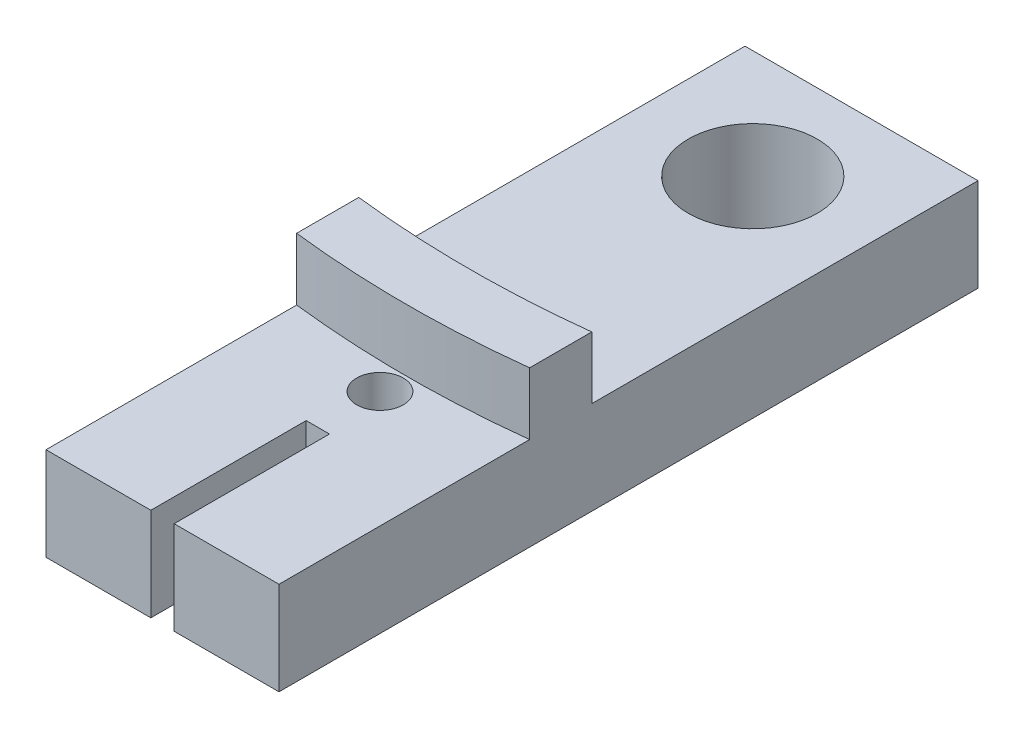
ISO-10303-21;
HEADER;
FILE_DESCRIPTION(('STEP AP214'),'2;1');
FILE_NAME('part.step','',(''),(''),'','','');
FILE_SCHEMA(('AUTOMOTIVE_DESIGN { 1 0 10303 214 1 1 1 1 }'));
ENDSEC;
DATA;
#1=APPLICATION_CONTEXT('core data for automotive mechanical design processes');
#2=APPLICATION_PROTOCOL_DEFINITION('international standard','automotive_design',2000,#1);
#3=PRODUCT_CONTEXT('',#1,'mechanical');
#4=PRODUCT('Part','Part','',(#3));
#5=PRODUCT_RELATED_PRODUCT_CATEGORY('part','',(#4));
#6=PRODUCT_DEFINITION_FORMATION('','',#4);
#7=PRODUCT_DEFINITION_CONTEXT('part definition',#1,'design');
#8=PRODUCT_DEFINITION('design','',#6,#7);
#9=PRODUCT_DEFINITION_SHAPE('','',#8);
#10=(LENGTH_UNIT() NAMED_UNIT(*) SI_UNIT(.MILLI.,.METRE.));
#11=(NAMED_UNIT(*) PLANE_ANGLE_UNIT() SI_UNIT($,.RADIAN.));
#12=(NAMED_UNIT(*) SI_UNIT($,.STERADIAN.) SOLID_ANGLE_UNIT());
#13=UNCERTAINTY_MEASURE_WITH_UNIT(LENGTH_MEASURE(1.E-05),#10,'distance_accuracy_value','');
#14=(GEOMETRIC_REPRESENTATION_CONTEXT(3) GLOBAL_UNCERTAINTY_ASSIGNED_CONTEXT((#13)) GLOBAL_UNIT_ASSIGNED_CONTEXT((#10,
#11,#12)) REPRESENTATION_CONTEXT('',''));
#15=CARTESIAN_POINT('',(0.,0.,0.));
#16=DIRECTION('',(0.,0.,1.));
#17=DIRECTION('',(1.,0.,0.));
#18=AXIS2_PLACEMENT_3D('',#15,#16,#17);
#19=CARTESIAN_POINT('',(7.50000000000001,6.,17.5));
#20=DIRECTION('',(0.,0.,-1.));
#21=DIRECTION('',(-1.,0.,0.));
#22=AXIS2_PLACEMENT_3D('',#19,#20,#21);
#23=PLANE('',#22);
#24=DIRECTION('',(0.,1.,0.));
#25=VECTOR('',#24,1.);
#26=CARTESIAN_POINT('',(-0.749999999999996,6.,17.5));
#27=LINE('',#26,#25);
#28=CARTESIAN_POINT('',(-0.749999999999995,0.,17.5));
#29=VERTEX_POINT('',#28);
#30=CARTESIAN_POINT('',(-0.749999999999995,6.,17.5));
#31=VERTEX_POINT('',#30);
#32=EDGE_CURVE('E54',#29,#31,#27,.T.);
#33=ORIENTED_EDGE('',*,*,#32,.F.);
#34=DIRECTION('',(1.,0.,0.));
#35=VECTOR('',#34,1.);
#36=CARTESIAN_POINT('',(7.50000000000001,0.,17.5));
#37=LINE('',#36,#35);
#38=CARTESIAN_POINT('',(0.750000000000004,0.,17.5));
#39=VERTEX_POINT('',#38);
#40=EDGE_CURVE('E132',#29,#39,#37,.T.);
#41=ORIENTED_EDGE('',*,*,#40,.T.);
#42=DIRECTION('',(0.,-1.,0.));
#43=VECTOR('',#42,1.);
#44=CARTESIAN_POINT('',(0.750000000000004,6.,17.5));
#45=LINE('',#44,#43);
#46=CARTESIAN_POINT('',(0.750000000000004,6.,17.5));
#47=VERTEX_POINT('',#46);
#48=EDGE_CURVE('E158',#47,#39,#45,.T.);
#49=ORIENTED_EDGE('',*,*,#48,.F.);
#50=DIRECTION('',(1.,0.,0.));
#51=VECTOR('',#50,1.);
#52=CARTESIAN_POINT('',(7.50000000000001,6.,17.5));
#53=LINE('',#52,#51);
#54=EDGE_CURVE('E50',#31,#47,#53,.T.);
#55=ORIENTED_EDGE('',*,*,#54,.F.);
#56=EDGE_LOOP('',(#33,#41,#49,#55));
#57=FACE_BOUND('',#56,.T.);
#58=ADVANCED_FACE('F35',(#57),#23,.F.);
#59=CARTESIAN_POINT('',(0.,6.,0.));
#60=DIRECTION('',(0.,1.,0.));
#61=DIRECTION('',(0.,0.,1.));
#62=AXIS2_PLACEMENT_3D('',#59,#60,#61);
#63=PLANE('',#62);
#64=CARTESIAN_POINT('',(0.,6.,-57.2));
#65=DIRECTION('',(0.,-1.,0.));
#66=DIRECTION('',(0.,0.,-1.));
#67=AXIS2_PLACEMENT_3D('',#64,#65,#66);
#68=CIRCLE('',#67,65.);
#69=CARTESIAN_POINT('',(7.50000000000001,6.,7.36585785072479));
#70=VERTEX_POINT('',#69);
#71=CARTESIAN_POINT('',(-7.5,6.,7.36585785072479));
#72=VERTEX_POINT('',#71);
#73=EDGE_CURVE('E177',#70,#72,#68,.T.);
#74=ORIENTED_EDGE('',*,*,#73,.F.);
#75=DIRECTION('',(0.,0.,-1.));
#76=VECTOR('',#75,1.);
#77=CARTESIAN_POINT('',(7.50000000000001,6.,17.5));
#78=LINE('',#77,#76);
#79=CARTESIAN_POINT('',(7.5,6.,-17.5));
#80=VERTEX_POINT('',#79);
#81=EDGE_CURVE('E219',#70,#80,#78,.T.);
#82=ORIENTED_EDGE('',*,*,#81,.T.);
#83=DIRECTION('',(-1.,0.,0.));
#84=VECTOR('',#83,1.);
#85=CARTESIAN_POINT('',(7.5,6.,-17.5));
#86=LINE('',#85,#84);
#87=CARTESIAN_POINT('',(-7.5,6.,-17.5));
#88=VERTEX_POINT('',#87);
#89=EDGE_CURVE('E222',#80,#88,#86,.T.);
#90=ORIENTED_EDGE('',*,*,#89,.T.);
#91=DIRECTION('',(0.,0.,1.));
#92=VECTOR('',#91,1.);
#93=CARTESIAN_POINT('',(-7.5,6.,17.5));
#94=LINE('',#93,#92);
#95=EDGE_CURVE('E215',#88,#72,#94,.T.);
#96=ORIENTED_EDGE('',*,*,#95,.T.);
#97=EDGE_LOOP('',(#74,#82,#90,#96));
#98=FACE_BOUND('',#97,.T.);
#99=CARTESIAN_POINT('',(0.,6.,-10.5));
#100=DIRECTION('',(0.,1.,0.));
#101=DIRECTION('',(0.,0.,1.));
#102=AXIS2_PLACEMENT_3D('',#99,#100,#101);
#103=CIRCLE('',#102,4.15);
#104=CARTESIAN_POINT('',(0.,6.,-6.35000000000002));
#105=VERTEX_POINT('',#104);
#106=EDGE_CURVE('E133',#105,#105,#103,.T.);
#107=ORIENTED_EDGE('',*,*,#106,.F.);
#108=EDGE_LOOP('',(#107));
#109=FACE_BOUND('',#108,.T.);
#110=ADVANCED_FACE('F247',(#98,#109),#63,.T.);
#111=CARTESIAN_POINT('',(0.,6.,-53.2));
#112=DIRECTION('',(0.,1.,0.));
#113=DIRECTION('',(0.,0.,1.));
#114=AXIS2_PLACEMENT_3D('',#111,#112,#113);
#115=CIRCLE('',#114,65.);
#116=CARTESIAN_POINT('',(-7.5,6.,11.3658578507248));
#117=VERTEX_POINT('',#116);
#118=CARTESIAN_POINT('',(7.50000000000001,6.,11.3658578507248));
#119=VERTEX_POINT('',#118);
#120=EDGE_CURVE('E182',#117,#119,#115,.T.);
#121=ORIENTED_EDGE('',*,*,#120,.F.);
#122=CARTESIAN_POINT('',(-7.5,6.,27.5));
#123=VERTEX_POINT('',#122);
#124=EDGE_CURVE('E217',#117,#123,#94,.T.);
#125=ORIENTED_EDGE('',*,*,#124,.T.);
#126=DIRECTION('',(-1.,0.,0.));
#127=VECTOR('',#126,1.);
#128=CARTESIAN_POINT('',(-0.749999999999996,6.,27.5));
#129=LINE('',#128,#127);
#130=CARTESIAN_POINT('',(-0.749999999999996,6.,27.5));
#131=VERTEX_POINT('',#130);
#132=EDGE_CURVE('E148',#131,#123,#129,.T.);
#133=ORIENTED_EDGE('',*,*,#132,.F.);
#134=DIRECTION('',(0.,0.,-1.));
#135=VECTOR('',#134,1.);
#136=CARTESIAN_POINT('',(-0.749999999999996,6.,27.5));
#137=LINE('',#136,#135);
#138=EDGE_CURVE('E153',#131,#31,#137,.T.);
#139=ORIENTED_EDGE('',*,*,#138,.T.);
#140=ORIENTED_EDGE('',*,*,#54,.T.);
#141=DIRECTION('',(0.,0.,-1.));
#142=VECTOR('',#141,1.);
#143=CARTESIAN_POINT('',(0.750000000000004,6.,27.5));
#144=LINE('',#143,#142);
#145=CARTESIAN_POINT('',(0.750000000000004,6.,27.5));
#146=VERTEX_POINT('',#145);
#147=EDGE_CURVE('E174',#146,#47,#144,.T.);
#148=ORIENTED_EDGE('',*,*,#147,.F.);
#149=DIRECTION('',(-1.,0.,0.));
#150=VECTOR('',#149,1.);
#151=CARTESIAN_POINT('',(0.750000000000004,6.,27.5));
#152=LINE('',#151,#150);
#153=CARTESIAN_POINT('',(7.50000000000001,6.,27.5));
#154=VERTEX_POINT('',#153);
#155=EDGE_CURVE('E162',#154,#146,#152,.T.);
#156=ORIENTED_EDGE('',*,*,#155,.F.);
#157=EDGE_CURVE('E220',#154,#119,#78,.T.);
#158=ORIENTED_EDGE('',*,*,#157,.T.);
#159=EDGE_LOOP('',(#121,#125,#133,#139,#140,#148,#156,#158));
#160=FACE_BOUND('',#159,.T.);
#161=CARTESIAN_POINT('',(0.,6.,13.5));
#162=DIRECTION('',(0.,1.,0.));
#163=DIRECTION('',(0.,0.,1.));
#164=AXIS2_PLACEMENT_3D('',#161,#162,#163);
#165=CIRCLE('',#164,1.5);
#166=CARTESIAN_POINT('',(0.,6.,15.));
#167=VERTEX_POINT('',#166);
#168=EDGE_CURVE('E205',#167,#167,#165,.T.);
#169=ORIENTED_EDGE('',*,*,#168,.F.);
#170=EDGE_LOOP('',(#169));
#171=FACE_BOUND('',#170,.T.);
#172=ADVANCED_FACE('F230',(#160,#171),#63,.T.);
#173=CARTESIAN_POINT('',(0.,0.,0.));
#174=DIRECTION('',(0.,1.,0.));
#175=DIRECTION('',(0.,0.,1.));
#176=AXIS2_PLACEMENT_3D('',#173,#174,#175);
#177=PLANE('',#176);
#178=DIRECTION('',(0.,0.,1.));
#179=VECTOR('',#178,1.);
#180=CARTESIAN_POINT('',(-7.5,0.,17.5));
#181=LINE('',#180,#179);
#182=CARTESIAN_POINT('',(-7.5,0.,-17.5));
#183=VERTEX_POINT('',#182);
#184=CARTESIAN_POINT('',(-7.5,0.,27.5));
#185=VERTEX_POINT('',#184);
#186=EDGE_CURVE('E123',#183,#185,#181,.T.);
#187=ORIENTED_EDGE('',*,*,#186,.F.);
#188=DIRECTION('',(-1.,0.,0.));
#189=VECTOR('',#188,1.);
#190=CARTESIAN_POINT('',(7.5,0.,-17.5));
#191=LINE('',#190,#189);
#192=CARTESIAN_POINT('',(7.5,0.,-17.5));
#193=VERTEX_POINT('',#192);
#194=EDGE_CURVE('E227',#193,#183,#191,.T.);
#195=ORIENTED_EDGE('',*,*,#194,.F.);
#196=DIRECTION('',(0.,0.,-1.));
#197=VECTOR('',#196,1.);
#198=CARTESIAN_POINT('',(7.50000000000001,0.,17.5));
#199=LINE('',#198,#197);
#200=CARTESIAN_POINT('',(7.50000000000001,0.,27.5));
#201=VERTEX_POINT('',#200);
#202=EDGE_CURVE('E225',#201,#193,#199,.T.);
#203=ORIENTED_EDGE('',*,*,#202,.F.);
#204=DIRECTION('',(1.,0.,0.));
#205=VECTOR('',#204,1.);
#206=CARTESIAN_POINT('',(0.750000000000004,0.,27.5));
#207=LINE('',#206,#205);
#208=CARTESIAN_POINT('',(0.750000000000004,0.,27.5));
#209=VERTEX_POINT('',#208);
#210=EDGE_CURVE('E166',#209,#201,#207,.T.);
#211=ORIENTED_EDGE('',*,*,#210,.F.);
#212=DIRECTION('',(0.,0.,-1.));
#213=VECTOR('',#212,1.);
#214=CARTESIAN_POINT('',(0.750000000000004,0.,27.5));
#215=LINE('',#214,#213);
#216=EDGE_CURVE('E169',#209,#39,#215,.T.);
#217=ORIENTED_EDGE('',*,*,#216,.T.);
#218=ORIENTED_EDGE('',*,*,#40,.F.);
#219=DIRECTION('',(0.,0.,-1.));
#220=VECTOR('',#219,1.);
#221=CARTESIAN_POINT('',(-0.749999999999996,0.,27.5));
#222=LINE('',#221,#220);
#223=CARTESIAN_POINT('',(-0.749999999999996,0.,27.5));
#224=VERTEX_POINT('',#223);
#225=EDGE_CURVE('E140',#224,#29,#222,.T.);
#226=ORIENTED_EDGE('',*,*,#225,.F.);
#227=DIRECTION('',(1.,0.,0.));
#228=VECTOR('',#227,1.);
#229=CARTESIAN_POINT('',(-0.749999999999996,0.,27.5));
#230=LINE('',#229,#228);
#231=EDGE_CURVE('E136',#185,#224,#230,.T.);
#232=ORIENTED_EDGE('',*,*,#231,.F.);
#233=EDGE_LOOP('',(#187,#195,#203,#211,#217,#218,#226,#232));
#234=FACE_BOUND('',#233,.T.);
#235=CARTESIAN_POINT('',(0.,0.,-10.5));
#236=DIRECTION('',(0.,1.,0.));
#237=DIRECTION('',(0.,0.,1.));
#238=AXIS2_PLACEMENT_3D('',#235,#236,#237);
#239=CIRCLE('',#238,4.15);
#240=CARTESIAN_POINT('',(0.,0.,-6.35000000000002));
#241=VERTEX_POINT('',#240);
#242=EDGE_CURVE('E208',#241,#241,#239,.T.);
#243=ORIENTED_EDGE('',*,*,#242,.T.);
#244=EDGE_LOOP('',(#243));
#245=FACE_BOUND('',#244,.T.);
#246=CARTESIAN_POINT('',(0.,0.,13.5));
#247=DIRECTION('',(0.,1.,0.));
#248=DIRECTION('',(0.,0.,1.));
#249=AXIS2_PLACEMENT_3D('',#246,#247,#248);
#250=CIRCLE('',#249,1.5);
#251=CARTESIAN_POINT('',(0.,0.,15.));
#252=VERTEX_POINT('',#251);
#253=EDGE_CURVE('E204',#252,#252,#250,.T.);
#254=ORIENTED_EDGE('',*,*,#253,.T.);
#255=EDGE_LOOP('',(#254));
#256=FACE_BOUND('',#255,.T.);
#257=ADVANCED_FACE('F137',(#234,#245,#256),#177,.F.);
#258=CARTESIAN_POINT('',(-7.5,6.,17.5));
#259=DIRECTION('',(1.,0.,0.));
#260=DIRECTION('',(0.,0.,-1.));
#261=AXIS2_PLACEMENT_3D('',#258,#259,#260);
#262=PLANE('',#261);
#263=ORIENTED_EDGE('',*,*,#186,.T.);
#264=DIRECTION('',(0.,-1.,0.));
#265=VECTOR('',#264,1.);
#266=CARTESIAN_POINT('',(-7.5,6.,27.5));
#267=LINE('',#266,#265);
#268=EDGE_CURVE('E127',#123,#185,#267,.T.);
#269=ORIENTED_EDGE('',*,*,#268,.F.);
#270=ORIENTED_EDGE('',*,*,#124,.F.);
#271=DIRECTION('',(0.,-1.,0.));
#272=VECTOR('',#271,1.);
#273=CARTESIAN_POINT('',(-7.50000000000005,10.,11.3658578507248));
#274=LINE('',#273,#272);
#275=CARTESIAN_POINT('',(-7.50000000000005,10.,11.3658578507248));
#276=VERTEX_POINT('',#275);
#277=EDGE_CURVE('E198',#276,#117,#274,.T.);
#278=ORIENTED_EDGE('',*,*,#277,.F.);
#279=DIRECTION('',(0.,0.,1.));
#280=VECTOR('',#279,1.);
#281=CARTESIAN_POINT('',(-7.5,10.,11.3658578507248));
#282=LINE('',#281,#280);
#283=CARTESIAN_POINT('',(-7.5,10.,7.36585785072478));
#284=VERTEX_POINT('',#283);
#285=EDGE_CURVE('E181',#284,#276,#282,.T.);
#286=ORIENTED_EDGE('',*,*,#285,.F.);
#287=DIRECTION('',(0.,-1.,0.));
#288=VECTOR('',#287,1.);
#289=CARTESIAN_POINT('',(-7.5,10.,7.36585785072478));
#290=LINE('',#289,#288);
#291=EDGE_CURVE('E201',#284,#72,#290,.T.);
#292=ORIENTED_EDGE('',*,*,#291,.T.);
#293=ORIENTED_EDGE('',*,*,#95,.F.);
#294=DIRECTION('',(0.,-1.,0.));
#295=VECTOR('',#294,1.);
#296=CARTESIAN_POINT('',(-7.5,6.,-17.5));
#297=LINE('',#296,#295);
#298=EDGE_CURVE('E43',#88,#183,#297,.T.);
#299=ORIENTED_EDGE('',*,*,#298,.T.);
#300=EDGE_LOOP('',(#263,#269,#270,#278,#286,#292,#293,#299));
#301=FACE_BOUND('',#300,.T.);
#302=ADVANCED_FACE('F37',(#301),#262,.F.);
#303=CARTESIAN_POINT('',(7.50000000000001,6.,17.5));
#304=DIRECTION('',(-1.,0.,0.));
#305=DIRECTION('',(0.,0.,1.));
#306=AXIS2_PLACEMENT_3D('',#303,#304,#305);
#307=PLANE('',#306);
#308=ORIENTED_EDGE('',*,*,#202,.T.);
#309=DIRECTION('',(0.,-1.,0.));
#310=VECTOR('',#309,1.);
#311=CARTESIAN_POINT('',(7.5,6.,-17.5));
#312=LINE('',#311,#310);
#313=EDGE_CURVE('E11',#80,#193,#312,.T.);
#314=ORIENTED_EDGE('',*,*,#313,.F.);
#315=ORIENTED_EDGE('',*,*,#81,.F.);
#316=DIRECTION('',(0.,-1.,0.));
#317=VECTOR('',#316,1.);
#318=CARTESIAN_POINT('',(7.50000000000001,10.,7.36585785072477));
#319=LINE('',#318,#317);
#320=CARTESIAN_POINT('',(7.50000000000001,10.,7.36585785072477));
#321=VERTEX_POINT('',#320);
#322=EDGE_CURVE('E188',#321,#70,#319,.T.);
#323=ORIENTED_EDGE('',*,*,#322,.F.);
#324=DIRECTION('',(0.,0.,-1.));
#325=VECTOR('',#324,1.);
#326=CARTESIAN_POINT('',(7.50000000000001,10.,7.36585785072477));
#327=LINE('',#326,#325);
#328=CARTESIAN_POINT('',(7.50000000000001,10.,11.3658578507248));
#329=VERTEX_POINT('',#328);
#330=EDGE_CURVE('E186',#329,#321,#327,.T.);
#331=ORIENTED_EDGE('',*,*,#330,.F.);
#332=DIRECTION('',(0.,-1.,0.));
#333=VECTOR('',#332,1.);
#334=CARTESIAN_POINT('',(7.50000000000001,10.,11.3658578507248));
#335=LINE('',#334,#333);
#336=EDGE_CURVE('E195',#329,#119,#335,.T.);
#337=ORIENTED_EDGE('',*,*,#336,.T.);
#338=ORIENTED_EDGE('',*,*,#157,.F.);
#339=DIRECTION('',(0.,1.,0.));
#340=VECTOR('',#339,1.);
#341=CARTESIAN_POINT('',(7.50000000000001,6.,27.5));
#342=LINE('',#341,#340);
#343=EDGE_CURVE('E159',#201,#154,#342,.T.);
#344=ORIENTED_EDGE('',*,*,#343,.F.);
#345=EDGE_LOOP('',(#308,#314,#315,#323,#331,#337,#338,#344));
#346=FACE_BOUND('',#345,.T.);
#347=ADVANCED_FACE('F251',(#346),#307,.F.);
#348=CARTESIAN_POINT('',(7.5,6.,-17.5));
#349=DIRECTION('',(0.,0.,1.));
#350=DIRECTION('',(1.,0.,0.));
#351=AXIS2_PLACEMENT_3D('',#348,#349,#350);
#352=PLANE('',#351);
#353=ORIENTED_EDGE('',*,*,#194,.T.);
#354=ORIENTED_EDGE('',*,*,#298,.F.);
#355=ORIENTED_EDGE('',*,*,#89,.F.);
#356=ORIENTED_EDGE('',*,*,#313,.T.);
#357=EDGE_LOOP('',(#353,#354,#355,#356));
#358=FACE_BOUND('',#357,.T.);
#359=ADVANCED_FACE('F254',(#358),#352,.F.);
#360=CARTESIAN_POINT('',(0.,6.,-10.5));
#361=DIRECTION('',(0.,-1.,0.));
#362=DIRECTION('',(0.,0.,-1.));
#363=AXIS2_PLACEMENT_3D('',#360,#361,#362);
#364=CYLINDRICAL_SURFACE('',#363,4.15);
#365=ORIENTED_EDGE('',*,*,#106,.T.);
#366=EDGE_LOOP('',(#365));
#367=FACE_BOUND('',#366,.T.);
#368=ORIENTED_EDGE('',*,*,#242,.F.);
#369=EDGE_LOOP('',(#368));
#370=FACE_BOUND('',#369,.T.);
#371=ADVANCED_FACE('F256',(#367,#370),#364,.F.);
#372=CARTESIAN_POINT('',(0.,6.,13.5));
#373=DIRECTION('',(0.,-1.,0.));
#374=DIRECTION('',(0.,0.,-1.));
#375=AXIS2_PLACEMENT_3D('',#372,#373,#374);
#376=CYLINDRICAL_SURFACE('',#375,1.5);
#377=ORIENTED_EDGE('',*,*,#168,.T.);
#378=EDGE_LOOP('',(#377));
#379=FACE_BOUND('',#378,.T.);
#380=ORIENTED_EDGE('',*,*,#253,.F.);
#381=EDGE_LOOP('',(#380));
#382=FACE_BOUND('',#381,.T.);
#383=ADVANCED_FACE('F262',(#379,#382),#376,.F.);
#384=CARTESIAN_POINT('',(0.,10.,-57.2));
#385=DIRECTION('',(0.,-1.,0.));
#386=DIRECTION('',(0.,0.,-1.));
#387=AXIS2_PLACEMENT_3D('',#384,#385,#386);
#388=CYLINDRICAL_SURFACE('',#387,65.);
#389=ORIENTED_EDGE('',*,*,#73,.T.);
#390=ORIENTED_EDGE('',*,*,#291,.F.);
#391=CARTESIAN_POINT('',(0.,10.,-57.2));
#392=DIRECTION('',(0.,-1.,0.));
#393=DIRECTION('',(0.,0.,-1.));
#394=AXIS2_PLACEMENT_3D('',#391,#392,#393);
#395=CIRCLE('',#394,65.);
#396=EDGE_CURVE('E178',#321,#284,#395,.T.);
#397=ORIENTED_EDGE('',*,*,#396,.F.);
#398=ORIENTED_EDGE('',*,*,#322,.T.);
#399=EDGE_LOOP('',(#389,#390,#397,#398));
#400=FACE_BOUND('',#399,.T.);
#401=ADVANCED_FACE('F244',(#400),#388,.F.);
#402=CARTESIAN_POINT('',(0.,10.,-53.2));
#403=DIRECTION('',(0.,-1.,0.));
#404=DIRECTION('',(0.,0.,-1.));
#405=AXIS2_PLACEMENT_3D('',#402,#403,#404);
#406=CYLINDRICAL_SURFACE('',#405,65.);
#407=ORIENTED_EDGE('',*,*,#120,.T.);
#408=ORIENTED_EDGE('',*,*,#336,.F.);
#409=CARTESIAN_POINT('',(0.,10.,-53.2));
#410=DIRECTION('',(0.,1.,0.));
#411=DIRECTION('',(0.,0.,1.));
#412=AXIS2_PLACEMENT_3D('',#409,#410,#411);
#413=CIRCLE('',#412,65.);
#414=EDGE_CURVE('E184',#276,#329,#413,.T.);
#415=ORIENTED_EDGE('',*,*,#414,.F.);
#416=ORIENTED_EDGE('',*,*,#277,.T.);
#417=EDGE_LOOP('',(#407,#408,#415,#416));
#418=FACE_BOUND('',#417,.T.);
#419=ADVANCED_FACE('F235',(#418),#406,.T.);
#420=CARTESIAN_POINT('',(0.,10.,-57.2));
#421=DIRECTION('',(0.,-1.,0.));
#422=DIRECTION('',(0.,0.,-1.));
#423=AXIS2_PLACEMENT_3D('',#420,#421,#422);
#424=PLANE('',#423);
#425=ORIENTED_EDGE('',*,*,#396,.T.);
#426=ORIENTED_EDGE('',*,*,#285,.T.);
#427=ORIENTED_EDGE('',*,*,#414,.T.);
#428=ORIENTED_EDGE('',*,*,#330,.T.);
#429=EDGE_LOOP('',(#425,#426,#427,#428));
#430=FACE_BOUND('',#429,.T.);
#431=ADVANCED_FACE('F239',(#430),#424,.F.);
#432=CARTESIAN_POINT('',(0.750000000000004,6.,27.5));
#433=DIRECTION('',(1.,0.,0.));
#434=DIRECTION('',(0.,0.,-1.));
#435=AXIS2_PLACEMENT_3D('',#432,#433,#434);
#436=PLANE('',#435);
#437=ORIENTED_EDGE('',*,*,#48,.T.);
#438=ORIENTED_EDGE('',*,*,#216,.F.);
#439=DIRECTION('',(0.,-1.,0.));
#440=VECTOR('',#439,1.);
#441=CARTESIAN_POINT('',(0.750000000000004,6.,27.5));
#442=LINE('',#441,#440);
#443=EDGE_CURVE('E164',#146,#209,#442,.T.);
#444=ORIENTED_EDGE('',*,*,#443,.F.);
#445=ORIENTED_EDGE('',*,*,#147,.T.);
#446=EDGE_LOOP('',(#437,#438,#444,#445));
#447=FACE_BOUND('',#446,.T.);
#448=ADVANCED_FACE('F292',(#447),#436,.F.);
#449=CARTESIAN_POINT('',(0.,0.,27.5));
#450=DIRECTION('',(0.,0.,1.));
#451=DIRECTION('',(1.,0.,0.));
#452=AXIS2_PLACEMENT_3D('',#449,#450,#451);
#453=PLANE('',#452);
#454=ORIENTED_EDGE('',*,*,#343,.T.);
#455=ORIENTED_EDGE('',*,*,#155,.T.);
#456=ORIENTED_EDGE('',*,*,#443,.T.);
#457=ORIENTED_EDGE('',*,*,#210,.T.);
#458=EDGE_LOOP('',(#454,#455,#456,#457));
#459=FACE_BOUND('',#458,.T.);
#460=ADVANCED_FACE('F295',(#459),#453,.T.);
#461=CARTESIAN_POINT('',(-0.749999999999996,6.,27.5));
#462=DIRECTION('',(-1.,0.,0.));
#463=DIRECTION('',(0.,0.,1.));
#464=AXIS2_PLACEMENT_3D('',#461,#462,#463);
#465=PLANE('',#464);
#466=ORIENTED_EDGE('',*,*,#32,.T.);
#467=ORIENTED_EDGE('',*,*,#138,.F.);
#468=DIRECTION('',(0.,1.,0.));
#469=VECTOR('',#468,1.);
#470=CARTESIAN_POINT('',(-0.749999999999996,6.,27.5));
#471=LINE('',#470,#469);
#472=EDGE_CURVE('E143',#224,#131,#471,.T.);
#473=ORIENTED_EDGE('',*,*,#472,.F.);
#474=ORIENTED_EDGE('',*,*,#225,.T.);
#475=EDGE_LOOP('',(#466,#467,#473,#474));
#476=FACE_BOUND('',#475,.T.);
#477=ADVANCED_FACE('F303',(#476),#465,.F.);
#478=CARTESIAN_POINT('',(0.,0.,27.5));
#479=DIRECTION('',(0.,0.,-1.));
#480=DIRECTION('',(-1.,0.,0.));
#481=AXIS2_PLACEMENT_3D('',#478,#479,#480);
#482=PLANE('',#481);
#483=ORIENTED_EDGE('',*,*,#268,.T.);
#484=ORIENTED_EDGE('',*,*,#231,.T.);
#485=ORIENTED_EDGE('',*,*,#472,.T.);
#486=ORIENTED_EDGE('',*,*,#132,.T.);
#487=EDGE_LOOP('',(#483,#484,#485,#486));
#488=FACE_BOUND('',#487,.T.);
#489=ADVANCED_FACE('F146',(#488),#482,.F.);
#490=CLOSED_SHELL('',(#58,#110,#172,#257,#302,#347,#359,#371,#383,#401,#419,#431,#448,#460,#477,#489));
#491=MANIFOLD_SOLID_BREP('B2',#490);
#492=ADVANCED_BREP_SHAPE_REPRESENTATION('',(#18,#491),#14);
#493=SHAPE_DEFINITION_REPRESENTATION(#9,#492);
ENDSEC;
END-ISO-10303-21;
